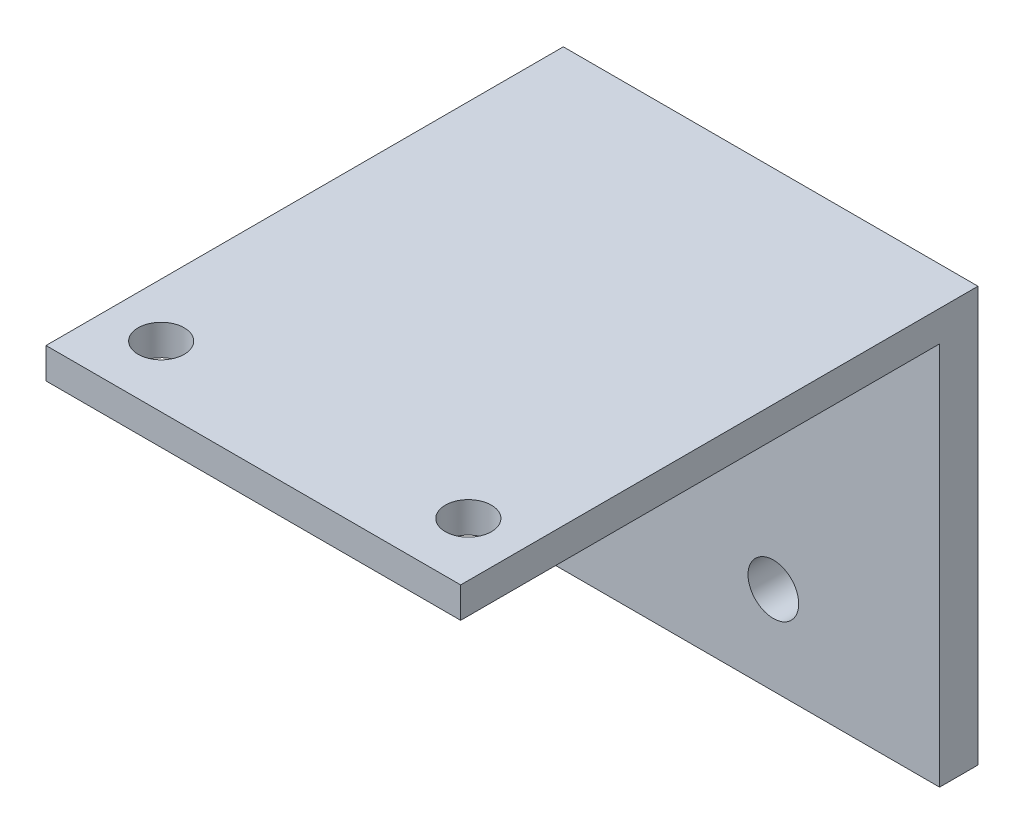
ISO-10303-21;
HEADER;
FILE_DESCRIPTION(('STEP AP214'),'2;1');
FILE_NAME('part.step','',(''),(''),'','','');
FILE_SCHEMA(('AUTOMOTIVE_DESIGN { 1 0 10303 214 1 1 1 1 }'));
ENDSEC;
DATA;
#1=APPLICATION_CONTEXT('core data for automotive mechanical design processes');
#2=APPLICATION_PROTOCOL_DEFINITION('international standard','automotive_design',2000,#1);
#3=PRODUCT_CONTEXT('',#1,'mechanical');
#4=PRODUCT('Part','Part','',(#3));
#5=PRODUCT_RELATED_PRODUCT_CATEGORY('part','',(#4));
#6=PRODUCT_DEFINITION_FORMATION('','',#4);
#7=PRODUCT_DEFINITION_CONTEXT('part definition',#1,'design');
#8=PRODUCT_DEFINITION('design','',#6,#7);
#9=PRODUCT_DEFINITION_SHAPE('','',#8);
#10=(LENGTH_UNIT() NAMED_UNIT(*) SI_UNIT(.MILLI.,.METRE.));
#11=(NAMED_UNIT(*) PLANE_ANGLE_UNIT() SI_UNIT($,.RADIAN.));
#12=(NAMED_UNIT(*) SI_UNIT($,.STERADIAN.) SOLID_ANGLE_UNIT());
#13=UNCERTAINTY_MEASURE_WITH_UNIT(LENGTH_MEASURE(1.E-05),#10,'distance_accuracy_value','');
#14=(GEOMETRIC_REPRESENTATION_CONTEXT(3) GLOBAL_UNCERTAINTY_ASSIGNED_CONTEXT((#13)) GLOBAL_UNIT_ASSIGNED_CONTEXT((#10,
#11,#12)) REPRESENTATION_CONTEXT('',''));
#15=CARTESIAN_POINT('',(0.,0.,0.));
#16=DIRECTION('',(0.,0.,1.));
#17=DIRECTION('',(1.,0.,0.));
#18=AXIS2_PLACEMENT_3D('',#15,#16,#17);
#19=CARTESIAN_POINT('',(0.,-27.,67.37));
#20=DIRECTION('',(0.,1.,0.));
#21=DIRECTION('',(0.,0.,1.));
#22=AXIS2_PLACEMENT_3D('',#19,#20,#21);
#23=PLANE('',#22);
#24=DIRECTION('',(1.,0.,0.));
#25=VECTOR('',#24,1.);
#26=CARTESIAN_POINT('',(0.,-27.,5.));
#27=LINE('',#26,#25);
#28=CARTESIAN_POINT('',(-27.,-27.,5.));
#29=VERTEX_POINT('',#28);
#30=CARTESIAN_POINT('',(27.,-27.,5.));
#31=VERTEX_POINT('',#30);
#32=EDGE_CURVE('E136',#29,#31,#27,.T.);
#33=ORIENTED_EDGE('',*,*,#32,.F.);
#34=DIRECTION('',(0.,0.,-1.));
#35=VECTOR('',#34,1.);
#36=CARTESIAN_POINT('',(-27.,-27.,67.37));
#37=LINE('',#36,#35);
#38=CARTESIAN_POINT('',(-27.,-27.,0.));
#39=VERTEX_POINT('',#38);
#40=EDGE_CURVE('E143',#29,#39,#37,.T.);
#41=ORIENTED_EDGE('',*,*,#40,.T.);
#42=DIRECTION('',(1.,0.,0.));
#43=VECTOR('',#42,1.);
#44=CARTESIAN_POINT('',(0.,-27.,0.));
#45=LINE('',#44,#43);
#46=CARTESIAN_POINT('',(27.,-27.,0.));
#47=VERTEX_POINT('',#46);
#48=EDGE_CURVE('E127',#39,#47,#45,.T.);
#49=ORIENTED_EDGE('',*,*,#48,.T.);
#50=DIRECTION('',(0.,0.,-1.));
#51=VECTOR('',#50,1.);
#52=CARTESIAN_POINT('',(27.,-27.,67.37));
#53=LINE('',#52,#51);
#54=EDGE_CURVE('E117',#31,#47,#53,.T.);
#55=ORIENTED_EDGE('',*,*,#54,.F.);
#56=EDGE_LOOP('',(#33,#41,#49,#55));
#57=FACE_BOUND('',#56,.T.);
#58=ADVANCED_FACE('F65',(#57),#23,.F.);
#59=CARTESIAN_POINT('',(-27.,0.,67.37));
#60=DIRECTION('',(-1.,0.,0.));
#61=DIRECTION('',(0.,0.,1.));
#62=AXIS2_PLACEMENT_3D('',#59,#60,#61);
#63=PLANE('',#62);
#64=DIRECTION('',(0.,0.,-1.));
#65=VECTOR('',#64,1.);
#66=CARTESIAN_POINT('',(-27.,23.,67.37));
#67=LINE('',#66,#65);
#68=CARTESIAN_POINT('',(-27.,23.,67.37));
#69=VERTEX_POINT('',#68);
#70=CARTESIAN_POINT('',(-27.,23.,5.));
#71=VERTEX_POINT('',#70);
#72=EDGE_CURVE('E152',#69,#71,#67,.T.);
#73=ORIENTED_EDGE('',*,*,#72,.F.);
#74=DIRECTION('',(0.,1.,0.));
#75=VECTOR('',#74,1.);
#76=CARTESIAN_POINT('',(-27.,0.,67.37));
#77=LINE('',#76,#75);
#78=CARTESIAN_POINT('',(-27.,27.,67.37));
#79=VERTEX_POINT('',#78);
#80=EDGE_CURVE('E159',#69,#79,#77,.T.);
#81=ORIENTED_EDGE('',*,*,#80,.T.);
#82=DIRECTION('',(0.,0.,-1.));
#83=VECTOR('',#82,1.);
#84=CARTESIAN_POINT('',(-27.,27.,67.37));
#85=LINE('',#84,#83);
#86=CARTESIAN_POINT('',(-27.,27.,0.));
#87=VERTEX_POINT('',#86);
#88=EDGE_CURVE('E145',#79,#87,#85,.T.);
#89=ORIENTED_EDGE('',*,*,#88,.T.);
#90=DIRECTION('',(0.,1.,0.));
#91=VECTOR('',#90,1.);
#92=CARTESIAN_POINT('',(-27.,0.,0.));
#93=LINE('',#92,#91);
#94=EDGE_CURVE('E131',#39,#87,#93,.T.);
#95=ORIENTED_EDGE('',*,*,#94,.F.);
#96=ORIENTED_EDGE('',*,*,#40,.F.);
#97=DIRECTION('',(0.,1.,0.));
#98=VECTOR('',#97,1.);
#99=CARTESIAN_POINT('',(-27.,0.,5.));
#100=LINE('',#99,#98);
#101=EDGE_CURVE('E132',#29,#71,#100,.T.);
#102=ORIENTED_EDGE('',*,*,#101,.T.);
#103=EDGE_LOOP('',(#73,#81,#89,#95,#96,#102));
#104=FACE_BOUND('',#103,.T.);
#105=ADVANCED_FACE('F158',(#104),#63,.T.);
#106=CARTESIAN_POINT('',(27.,0.,67.37));
#107=DIRECTION('',(-1.,0.,0.));
#108=DIRECTION('',(0.,0.,1.));
#109=AXIS2_PLACEMENT_3D('',#106,#107,#108);
#110=PLANE('',#109);
#111=DIRECTION('',(0.,1.,0.));
#112=VECTOR('',#111,1.);
#113=CARTESIAN_POINT('',(27.,0.,67.37));
#114=LINE('',#113,#112);
#115=CARTESIAN_POINT('',(27.,23.,67.37));
#116=VERTEX_POINT('',#115);
#117=CARTESIAN_POINT('',(27.,27.,67.37));
#118=VERTEX_POINT('',#117);
#119=EDGE_CURVE('E89',#116,#118,#114,.T.);
#120=ORIENTED_EDGE('',*,*,#119,.F.);
#121=DIRECTION('',(0.,0.,-1.));
#122=VECTOR('',#121,1.);
#123=CARTESIAN_POINT('',(27.,23.,67.37));
#124=LINE('',#123,#122);
#125=CARTESIAN_POINT('',(27.,23.,5.));
#126=VERTEX_POINT('',#125);
#127=EDGE_CURVE('E81',#116,#126,#124,.T.);
#128=ORIENTED_EDGE('',*,*,#127,.T.);
#129=DIRECTION('',(0.,1.,0.));
#130=VECTOR('',#129,1.);
#131=CARTESIAN_POINT('',(27.,0.,5.));
#132=LINE('',#131,#130);
#133=EDGE_CURVE('E12',#31,#126,#132,.T.);
#134=ORIENTED_EDGE('',*,*,#133,.F.);
#135=ORIENTED_EDGE('',*,*,#54,.T.);
#136=DIRECTION('',(0.,1.,0.));
#137=VECTOR('',#136,1.);
#138=CARTESIAN_POINT('',(27.,0.,0.));
#139=LINE('',#138,#137);
#140=CARTESIAN_POINT('',(27.,27.,0.));
#141=VERTEX_POINT('',#140);
#142=EDGE_CURVE('E120',#47,#141,#139,.T.);
#143=ORIENTED_EDGE('',*,*,#142,.T.);
#144=DIRECTION('',(0.,0.,-1.));
#145=VECTOR('',#144,1.);
#146=CARTESIAN_POINT('',(27.,27.,67.37));
#147=LINE('',#146,#145);
#148=EDGE_CURVE('E109',#118,#141,#147,.T.);
#149=ORIENTED_EDGE('',*,*,#148,.F.);
#150=EDGE_LOOP('',(#120,#128,#134,#135,#143,#149));
#151=FACE_BOUND('',#150,.T.);
#152=ADVANCED_FACE('F121',(#151),#110,.F.);
#153=CARTESIAN_POINT('',(0.,27.,67.37));
#154=DIRECTION('',(0.,1.,0.));
#155=DIRECTION('',(0.,0.,1.));
#156=AXIS2_PLACEMENT_3D('',#153,#154,#155);
#157=PLANE('',#156);
#158=CARTESIAN_POINT('',(20.,27.,59.37));
#159=DIRECTION('',(0.,1.,0.));
#160=DIRECTION('',(0.,0.,1.));
#161=AXIS2_PLACEMENT_3D('',#158,#159,#160);
#162=CIRCLE('',#161,3.);
#163=CARTESIAN_POINT('',(20.,27.,62.37));
#164=VERTEX_POINT('',#163);
#165=EDGE_CURVE('E177',#164,#164,#162,.T.);
#166=ORIENTED_EDGE('',*,*,#165,.F.);
#167=EDGE_LOOP('',(#166));
#168=FACE_BOUND('',#167,.T.);
#169=CARTESIAN_POINT('',(-20.,27.,59.37));
#170=DIRECTION('',(0.,1.,0.));
#171=DIRECTION('',(0.,0.,1.));
#172=AXIS2_PLACEMENT_3D('',#169,#170,#171);
#173=CIRCLE('',#172,3.);
#174=CARTESIAN_POINT('',(-20.,27.,62.37));
#175=VERTEX_POINT('',#174);
#176=EDGE_CURVE('E171',#175,#175,#173,.T.);
#177=ORIENTED_EDGE('',*,*,#176,.F.);
#178=EDGE_LOOP('',(#177));
#179=FACE_BOUND('',#178,.T.);
#180=DIRECTION('',(1.,0.,0.));
#181=VECTOR('',#180,1.);
#182=CARTESIAN_POINT('',(0.,27.,0.));
#183=LINE('',#182,#181);
#184=EDGE_CURVE('E113',#87,#141,#183,.T.);
#185=ORIENTED_EDGE('',*,*,#184,.F.);
#186=ORIENTED_EDGE('',*,*,#88,.F.);
#187=DIRECTION('',(1.,0.,0.));
#188=VECTOR('',#187,1.);
#189=CARTESIAN_POINT('',(0.,27.,67.37));
#190=LINE('',#189,#188);
#191=EDGE_CURVE('E115',#79,#118,#190,.T.);
#192=ORIENTED_EDGE('',*,*,#191,.T.);
#193=ORIENTED_EDGE('',*,*,#148,.T.);
#194=EDGE_LOOP('',(#185,#186,#192,#193));
#195=FACE_BOUND('',#194,.T.);
#196=ADVANCED_FACE('F67',(#168,#179,#195),#157,.T.);
#197=CARTESIAN_POINT('',(0.,0.,0.));
#198=DIRECTION('',(0.,0.,1.));
#199=DIRECTION('',(1.,0.,0.));
#200=AXIS2_PLACEMENT_3D('',#197,#198,#199);
#201=PLANE('',#200);
#202=CARTESIAN_POINT('',(5.35228383294536,-15.4999999999989,0.));
#203=DIRECTION('',(0.,0.,-1.));
#204=DIRECTION('',(-1.,0.,0.));
#205=AXIS2_PLACEMENT_3D('',#202,#203,#204);
#206=CIRCLE('',#205,3.29999999999999);
#207=CARTESIAN_POINT('',(2.05228383294537,-15.4999999999989,0.));
#208=VERTEX_POINT('',#207);
#209=EDGE_CURVE('E189',#208,#208,#206,.T.);
#210=ORIENTED_EDGE('',*,*,#209,.F.);
#211=EDGE_LOOP('',(#210));
#212=FACE_BOUND('',#211,.T.);
#213=CARTESIAN_POINT('',(5.35228383294534,16.5000000000011,0.));
#214=DIRECTION('',(0.,0.,-1.));
#215=DIRECTION('',(-1.,0.,0.));
#216=AXIS2_PLACEMENT_3D('',#213,#214,#215);
#217=CIRCLE('',#216,3.29999999999999);
#218=CARTESIAN_POINT('',(2.05228383294535,16.5000000000011,0.));
#219=VERTEX_POINT('',#218);
#220=EDGE_CURVE('E186',#219,#219,#217,.T.);
#221=ORIENTED_EDGE('',*,*,#220,.F.);
#222=EDGE_LOOP('',(#221));
#223=FACE_BOUND('',#222,.T.);
#224=ORIENTED_EDGE('',*,*,#184,.T.);
#225=ORIENTED_EDGE('',*,*,#142,.F.);
#226=ORIENTED_EDGE('',*,*,#48,.F.);
#227=ORIENTED_EDGE('',*,*,#94,.T.);
#228=EDGE_LOOP('',(#224,#225,#226,#227));
#229=FACE_BOUND('',#228,.T.);
#230=ADVANCED_FACE('F129',(#212,#223,#229),#201,.F.);
#231=CARTESIAN_POINT('',(0.,0.,67.37));
#232=DIRECTION('',(0.,0.,1.));
#233=DIRECTION('',(1.,0.,0.));
#234=AXIS2_PLACEMENT_3D('',#231,#232,#233);
#235=PLANE('',#234);
#236=DIRECTION('',(-1.,0.,0.));
#237=VECTOR('',#236,1.);
#238=CARTESIAN_POINT('',(0.,23.,67.37));
#239=LINE('',#238,#237);
#240=EDGE_CURVE('E74',#116,#69,#239,.T.);
#241=ORIENTED_EDGE('',*,*,#240,.F.);
#242=ORIENTED_EDGE('',*,*,#119,.T.);
#243=ORIENTED_EDGE('',*,*,#191,.F.);
#244=ORIENTED_EDGE('',*,*,#80,.F.);
#245=EDGE_LOOP('',(#241,#242,#243,#244));
#246=FACE_BOUND('',#245,.T.);
#247=ADVANCED_FACE('F163',(#246),#235,.T.);
#248=CARTESIAN_POINT('',(38.7750425347235,23.,5.));
#249=DIRECTION('',(0.,1.,0.));
#250=DIRECTION('',(0.,0.,1.));
#251=AXIS2_PLACEMENT_3D('',#248,#249,#250);
#252=PLANE('',#251);
#253=CARTESIAN_POINT('',(20.,23.,59.37));
#254=DIRECTION('',(0.,-1.,0.));
#255=DIRECTION('',(0.,0.,-1.));
#256=AXIS2_PLACEMENT_3D('',#253,#254,#255);
#257=CIRCLE('',#256,3.);
#258=CARTESIAN_POINT('',(20.,23.,56.37));
#259=VERTEX_POINT('',#258);
#260=EDGE_CURVE('E180',#259,#259,#257,.T.);
#261=ORIENTED_EDGE('',*,*,#260,.F.);
#262=EDGE_LOOP('',(#261));
#263=FACE_BOUND('',#262,.T.);
#264=CARTESIAN_POINT('',(-20.,23.,59.37));
#265=DIRECTION('',(0.,-1.,0.));
#266=DIRECTION('',(0.,0.,-1.));
#267=AXIS2_PLACEMENT_3D('',#264,#265,#266);
#268=CIRCLE('',#267,3.);
#269=CARTESIAN_POINT('',(-20.,23.,56.37));
#270=VERTEX_POINT('',#269);
#271=EDGE_CURVE('E174',#270,#270,#268,.T.);
#272=ORIENTED_EDGE('',*,*,#271,.F.);
#273=EDGE_LOOP('',(#272));
#274=FACE_BOUND('',#273,.T.);
#275=ORIENTED_EDGE('',*,*,#72,.T.);
#276=DIRECTION('',(-1.,0.,0.));
#277=VECTOR('',#276,1.);
#278=CARTESIAN_POINT('',(38.7750425347235,23.,5.));
#279=LINE('',#278,#277);
#280=EDGE_CURVE('E169',#126,#71,#279,.T.);
#281=ORIENTED_EDGE('',*,*,#280,.F.);
#282=ORIENTED_EDGE('',*,*,#127,.F.);
#283=ORIENTED_EDGE('',*,*,#240,.T.);
#284=EDGE_LOOP('',(#275,#281,#282,#283));
#285=FACE_BOUND('',#284,.T.);
#286=ADVANCED_FACE('F150',(#263,#274,#285),#252,.F.);
#287=CARTESIAN_POINT('',(0.,0.,5.));
#288=DIRECTION('',(0.,0.,1.));
#289=DIRECTION('',(1.,0.,0.));
#290=AXIS2_PLACEMENT_3D('',#287,#288,#289);
#291=PLANE('',#290);
#292=CARTESIAN_POINT('',(5.35228383294536,-15.4999999999989,5.));
#293=DIRECTION('',(0.,0.,1.));
#294=DIRECTION('',(1.,0.,0.));
#295=AXIS2_PLACEMENT_3D('',#292,#293,#294);
#296=CIRCLE('',#295,3.29999999999999);
#297=CARTESIAN_POINT('',(8.65228383294535,-15.4999999999989,5.));
#298=VERTEX_POINT('',#297);
#299=EDGE_CURVE('E69',#298,#298,#296,.T.);
#300=ORIENTED_EDGE('',*,*,#299,.F.);
#301=EDGE_LOOP('',(#300));
#302=FACE_BOUND('',#301,.T.);
#303=CARTESIAN_POINT('',(5.35228383294534,16.5000000000011,5.));
#304=DIRECTION('',(0.,0.,1.));
#305=DIRECTION('',(1.,0.,0.));
#306=AXIS2_PLACEMENT_3D('',#303,#304,#305);
#307=CIRCLE('',#306,3.29999999999999);
#308=CARTESIAN_POINT('',(8.65228383294533,16.5000000000011,5.));
#309=VERTEX_POINT('',#308);
#310=EDGE_CURVE('E183',#309,#309,#307,.T.);
#311=ORIENTED_EDGE('',*,*,#310,.F.);
#312=EDGE_LOOP('',(#311));
#313=FACE_BOUND('',#312,.T.);
#314=ORIENTED_EDGE('',*,*,#32,.T.);
#315=ORIENTED_EDGE('',*,*,#133,.T.);
#316=ORIENTED_EDGE('',*,*,#280,.T.);
#317=ORIENTED_EDGE('',*,*,#101,.F.);
#318=EDGE_LOOP('',(#314,#315,#316,#317));
#319=FACE_BOUND('',#318,.T.);
#320=ADVANCED_FACE('F198',(#302,#313,#319),#291,.T.);
#321=CARTESIAN_POINT('',(-20.,85.37,59.37));
#322=DIRECTION('',(0.,-1.,0.));
#323=DIRECTION('',(0.,0.,-1.));
#324=AXIS2_PLACEMENT_3D('',#321,#322,#323);
#325=CYLINDRICAL_SURFACE('',#324,3.);
#326=ORIENTED_EDGE('',*,*,#176,.T.);
#327=EDGE_LOOP('',(#326));
#328=FACE_BOUND('',#327,.T.);
#329=ORIENTED_EDGE('',*,*,#271,.T.);
#330=EDGE_LOOP('',(#329));
#331=FACE_BOUND('',#330,.T.);
#332=ADVANCED_FACE('F201',(#328,#331),#325,.F.);
#333=CARTESIAN_POINT('',(20.,85.37,59.37));
#334=DIRECTION('',(0.,-1.,0.));
#335=DIRECTION('',(0.,0.,-1.));
#336=AXIS2_PLACEMENT_3D('',#333,#334,#335);
#337=CYLINDRICAL_SURFACE('',#336,3.);
#338=ORIENTED_EDGE('',*,*,#165,.T.);
#339=EDGE_LOOP('',(#338));
#340=FACE_BOUND('',#339,.T.);
#341=ORIENTED_EDGE('',*,*,#260,.T.);
#342=EDGE_LOOP('',(#341));
#343=FACE_BOUND('',#342,.T.);
#344=ADVANCED_FACE('F229',(#340,#343),#337,.F.);
#345=CARTESIAN_POINT('',(5.35228383294534,16.5000000000011,0.));
#346=DIRECTION('',(0.,0.,-1.));
#347=DIRECTION('',(-1.,0.,0.));
#348=AXIS2_PLACEMENT_3D('',#345,#346,#347);
#349=CYLINDRICAL_SURFACE('',#348,3.29999999999999);
#350=ORIENTED_EDGE('',*,*,#310,.T.);
#351=EDGE_LOOP('',(#350));
#352=FACE_BOUND('',#351,.T.);
#353=ORIENTED_EDGE('',*,*,#220,.T.);
#354=EDGE_LOOP('',(#353));
#355=FACE_BOUND('',#354,.T.);
#356=ADVANCED_FACE('F233',(#352,#355),#349,.F.);
#357=CARTESIAN_POINT('',(5.35228383294536,-15.4999999999989,0.));
#358=DIRECTION('',(0.,0.,-1.));
#359=DIRECTION('',(-1.,0.,0.));
#360=AXIS2_PLACEMENT_3D('',#357,#358,#359);
#361=CYLINDRICAL_SURFACE('',#360,3.29999999999999);
#362=ORIENTED_EDGE('',*,*,#299,.T.);
#363=EDGE_LOOP('',(#362));
#364=FACE_BOUND('',#363,.T.);
#365=ORIENTED_EDGE('',*,*,#209,.T.);
#366=EDGE_LOOP('',(#365));
#367=FACE_BOUND('',#366,.T.);
#368=ADVANCED_FACE('F196',(#364,#367),#361,.F.);
#369=CLOSED_SHELL('',(#58,#105,#152,#196,#230,#247,#286,#320,#332,#344,#356,#368));
#370=MANIFOLD_SOLID_BREP('B2',#369);
#371=ADVANCED_BREP_SHAPE_REPRESENTATION('',(#18,#370),#14);
#372=SHAPE_DEFINITION_REPRESENTATION(#9,#371);
ENDSEC;
END-ISO-10303-21;
